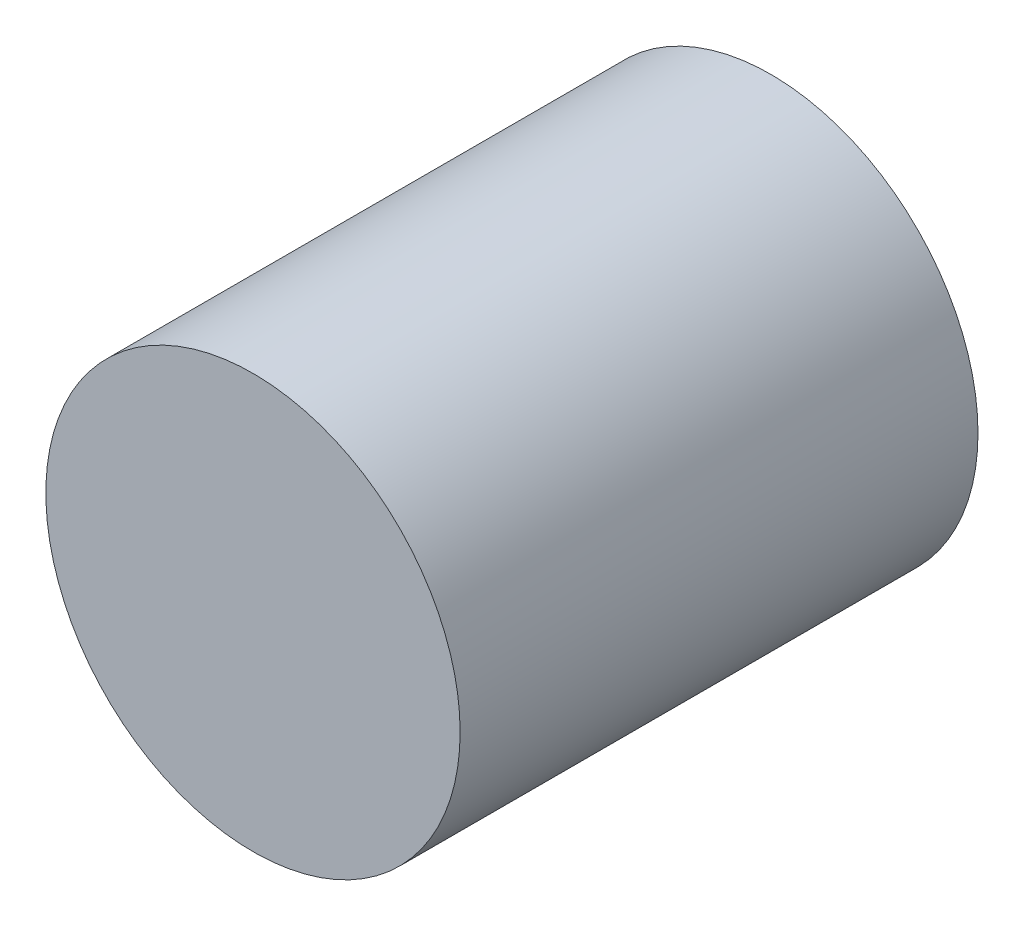
ISO-10303-21;
HEADER;
FILE_DESCRIPTION(('STEP AP214'),'2;1');
FILE_NAME('part.step','',(''),(''),'','','');
FILE_SCHEMA(('AUTOMOTIVE_DESIGN { 1 0 10303 214 1 1 1 1 }'));
ENDSEC;
DATA;
#1=APPLICATION_CONTEXT('core data for automotive mechanical design processes');
#2=APPLICATION_PROTOCOL_DEFINITION('international standard','automotive_design',2000,#1);
#3=PRODUCT_CONTEXT('',#1,'mechanical');
#4=PRODUCT('Part','Part','',(#3));
#5=PRODUCT_RELATED_PRODUCT_CATEGORY('part','',(#4));
#6=PRODUCT_DEFINITION_FORMATION('','',#4);
#7=PRODUCT_DEFINITION_CONTEXT('part definition',#1,'design');
#8=PRODUCT_DEFINITION('design','',#6,#7);
#9=PRODUCT_DEFINITION_SHAPE('','',#8);
#10=(LENGTH_UNIT() NAMED_UNIT(*) SI_UNIT(.MILLI.,.METRE.));
#11=(NAMED_UNIT(*) PLANE_ANGLE_UNIT() SI_UNIT($,.RADIAN.));
#12=(NAMED_UNIT(*) SI_UNIT($,.STERADIAN.) SOLID_ANGLE_UNIT());
#13=UNCERTAINTY_MEASURE_WITH_UNIT(LENGTH_MEASURE(1.E-05),#10,'distance_accuracy_value','');
#14=(GEOMETRIC_REPRESENTATION_CONTEXT(3) GLOBAL_UNCERTAINTY_ASSIGNED_CONTEXT((#13)) GLOBAL_UNIT_ASSIGNED_CONTEXT((#10,
#11,#12)) REPRESENTATION_CONTEXT('',''));
#15=CARTESIAN_POINT('',(0.,0.,0.));
#16=DIRECTION('',(0.,0.,1.));
#17=DIRECTION('',(1.,0.,0.));
#18=AXIS2_PLACEMENT_3D('',#15,#16,#17);
#19=CARTESIAN_POINT('',(0.,0.,-125.));
#20=DIRECTION('',(0.,0.,1.));
#21=DIRECTION('',(1.,0.,0.));
#22=AXIS2_PLACEMENT_3D('',#19,#20,#21);
#23=CYLINDRICAL_SURFACE('',#22,50.);
#24=CARTESIAN_POINT('',(0.,0.,-125.));
#25=DIRECTION('',(0.,0.,1.));
#26=DIRECTION('',(1.,0.,0.));
#27=AXIS2_PLACEMENT_3D('',#24,#25,#26);
#28=CIRCLE('',#27,50.);
#29=CARTESIAN_POINT('',(50.,0.,-125.));
#30=VERTEX_POINT('',#29);
#31=EDGE_CURVE('E11',#30,#30,#28,.T.);
#32=ORIENTED_EDGE('',*,*,#31,.T.);
#33=EDGE_LOOP('',(#32));
#34=FACE_BOUND('',#33,.T.);
#35=CARTESIAN_POINT('',(0.,0.,0.));
#36=DIRECTION('',(0.,0.,1.));
#37=DIRECTION('',(1.,0.,0.));
#38=AXIS2_PLACEMENT_3D('',#35,#36,#37);
#39=CIRCLE('',#38,50.);
#40=CARTESIAN_POINT('',(50.,0.,0.));
#41=VERTEX_POINT('',#40);
#42=EDGE_CURVE('E40',#41,#41,#39,.T.);
#43=ORIENTED_EDGE('',*,*,#42,.F.);
#44=EDGE_LOOP('',(#43));
#45=FACE_BOUND('',#44,.T.);
#46=ADVANCED_FACE('F37',(#34,#45),#23,.T.);
#47=CARTESIAN_POINT('',(0.,0.,-125.));
#48=DIRECTION('',(0.,0.,1.));
#49=DIRECTION('',(1.,0.,0.));
#50=AXIS2_PLACEMENT_3D('',#47,#48,#49);
#51=PLANE('',#50);
#52=CARTESIAN_POINT('',(0.,0.,-125.));
#53=DIRECTION('',(0.,0.,-1.));
#54=DIRECTION('',(-1.,0.,0.));
#55=AXIS2_PLACEMENT_3D('',#52,#53,#54);
#56=CIRCLE('',#55,45.8924356643997);
#57=CARTESIAN_POINT('',(-45.8924356643997,0.,-125.));
#58=VERTEX_POINT('',#57);
#59=EDGE_CURVE('E53',#58,#58,#56,.T.);
#60=ORIENTED_EDGE('',*,*,#59,.F.);
#61=EDGE_LOOP('',(#60));
#62=FACE_BOUND('',#61,.T.);
#63=ORIENTED_EDGE('',*,*,#31,.F.);
#64=EDGE_LOOP('',(#63));
#65=FACE_BOUND('',#64,.T.);
#66=ADVANCED_FACE('F65',(#62,#65),#51,.F.);
#67=CARTESIAN_POINT('',(0.,0.,0.));
#68=DIRECTION('',(0.,0.,1.));
#69=DIRECTION('',(1.,0.,0.));
#70=AXIS2_PLACEMENT_3D('',#67,#68,#69);
#71=PLANE('',#70);
#72=ORIENTED_EDGE('',*,*,#42,.T.);
#73=EDGE_LOOP('',(#72));
#74=FACE_BOUND('',#73,.T.);
#75=ADVANCED_FACE('F49',(#74),#71,.T.);
#76=CARTESIAN_POINT('',(0.,45.8924356643997,-125.));
#77=CARTESIAN_POINT('',(0.,41.969471567936,-73.943461012917));
#78=CARTESIAN_POINT('',(0.,49.2991878792278,-42.8849629868549));
#79=CARTESIAN_POINT('',(0.,0.,-5.99896374645692));
#80=B_SPLINE_CURVE_WITH_KNOTS('',3,(#76,#77,#78,#79),.UNSPECIFIED.,.F.,.F.,(4,4),(0.,1.),.UNSPECIFIED.);
#81=CARTESIAN_POINT('',(0.,0.,-125.));
#82=DIRECTION('',(0.,0.,-1.));
#83=AXIS1_PLACEMENT('',#81,#82);
#84=SURFACE_OF_REVOLUTION('',#80,#83);
#85=CARTESIAN_POINT('',(0.,0.,-5.99896374645692));
#86=VERTEX_POINT('',#85);
#87=VERTEX_LOOP('',#86);
#88=FACE_BOUND('',#87,.T.);
#89=ORIENTED_EDGE('',*,*,#59,.T.);
#90=EDGE_LOOP('',(#89));
#91=FACE_BOUND('',#90,.T.);
#92=ADVANCED_FACE('F46',(#88,#91),#84,.T.);
#93=CLOSED_SHELL('',(#46,#66,#75,#92));
#94=MANIFOLD_SOLID_BREP('B2',#93);
#95=ADVANCED_BREP_SHAPE_REPRESENTATION('',(#18,#94),#14);
#96=SHAPE_DEFINITION_REPRESENTATION(#9,#95);
ENDSEC;
END-ISO-10303-21;
